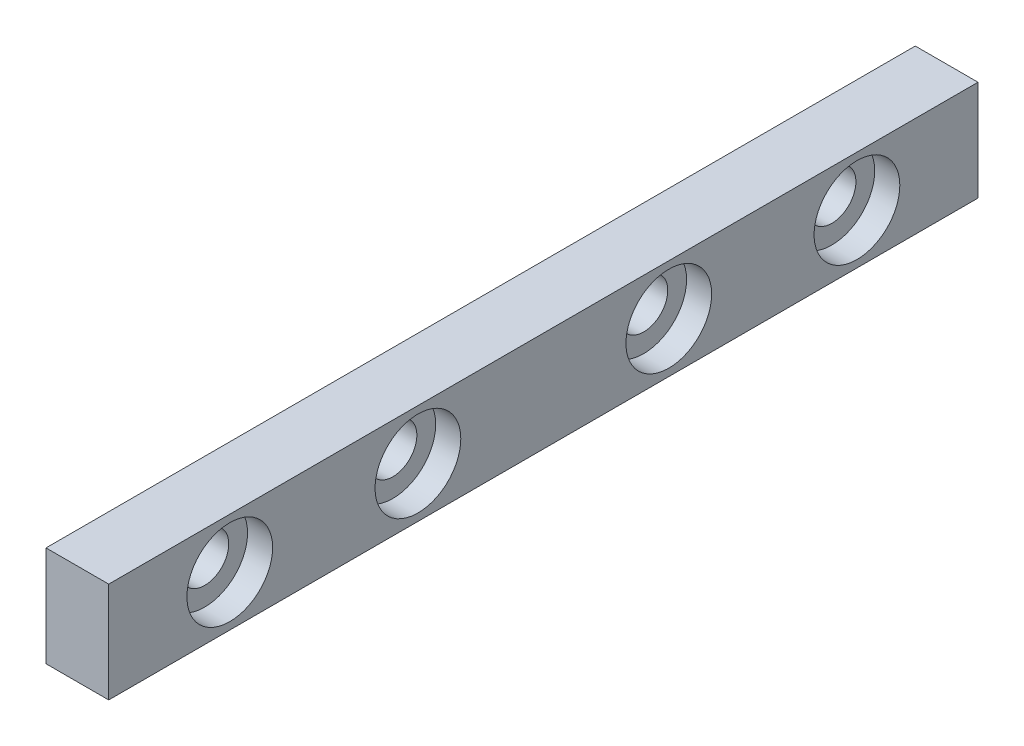
ISO-10303-21;
HEADER;
FILE_DESCRIPTION(('STEP AP214'),'2;1');
FILE_NAME('part.step','',(''),(''),'','','');
FILE_SCHEMA(('AUTOMOTIVE_DESIGN { 1 0 10303 214 1 1 1 1 }'));
ENDSEC;
DATA;
#1=APPLICATION_CONTEXT('core data for automotive mechanical design processes');
#2=APPLICATION_PROTOCOL_DEFINITION('international standard','automotive_design',2000,#1);
#3=PRODUCT_CONTEXT('',#1,'mechanical');
#4=PRODUCT('Part','Part','',(#3));
#5=PRODUCT_RELATED_PRODUCT_CATEGORY('part','',(#4));
#6=PRODUCT_DEFINITION_FORMATION('','',#4);
#7=PRODUCT_DEFINITION_CONTEXT('part definition',#1,'design');
#8=PRODUCT_DEFINITION('design','',#6,#7);
#9=PRODUCT_DEFINITION_SHAPE('','',#8);
#10=(LENGTH_UNIT() NAMED_UNIT(*) SI_UNIT(.MILLI.,.METRE.));
#11=(NAMED_UNIT(*) PLANE_ANGLE_UNIT() SI_UNIT($,.RADIAN.));
#12=(NAMED_UNIT(*) SI_UNIT($,.STERADIAN.) SOLID_ANGLE_UNIT());
#13=UNCERTAINTY_MEASURE_WITH_UNIT(LENGTH_MEASURE(1.E-05),#10,'distance_accuracy_value','');
#14=(GEOMETRIC_REPRESENTATION_CONTEXT(3) GLOBAL_UNCERTAINTY_ASSIGNED_CONTEXT((#13)) GLOBAL_UNIT_ASSIGNED_CONTEXT((#10,
#11,#12)) REPRESENTATION_CONTEXT('',''));
#15=CARTESIAN_POINT('',(0.,0.,0.));
#16=DIRECTION('',(0.,0.,1.));
#17=DIRECTION('',(1.,0.,0.));
#18=AXIS2_PLACEMENT_3D('',#15,#16,#17);
#19=CARTESIAN_POINT('',(3.,2.4,-14.79));
#20=DIRECTION('',(-1.,0.,0.));
#21=DIRECTION('',(0.,0.,1.));
#22=AXIS2_PLACEMENT_3D('',#19,#20,#21);
#23=CYLINDRICAL_SURFACE('',#22,1.15);
#24=CARTESIAN_POINT('',(0.,2.4,-14.79));
#25=DIRECTION('',(1.,0.,0.));
#26=DIRECTION('',(0.,0.,-1.));
#27=AXIS2_PLACEMENT_3D('',#24,#25,#26);
#28=CIRCLE('',#27,1.15);
#29=CARTESIAN_POINT('',(0.,2.4,-15.94));
#30=VERTEX_POINT('',#29);
#31=EDGE_CURVE('E110',#30,#30,#28,.T.);
#32=ORIENTED_EDGE('',*,*,#31,.F.);
#33=EDGE_LOOP('',(#32));
#34=FACE_BOUND('',#33,.T.);
#35=CARTESIAN_POINT('',(1.8,2.4,-14.79));
#36=DIRECTION('',(1.,0.,0.));
#37=DIRECTION('',(0.,0.,-1.));
#38=AXIS2_PLACEMENT_3D('',#35,#36,#37);
#39=CIRCLE('',#38,1.15);
#40=CARTESIAN_POINT('',(1.8,2.4,-15.94));
#41=VERTEX_POINT('',#40);
#42=EDGE_CURVE('E44',#41,#41,#39,.T.);
#43=ORIENTED_EDGE('',*,*,#42,.T.);
#44=EDGE_LOOP('',(#43));
#45=FACE_BOUND('',#44,.T.);
#46=ADVANCED_FACE('F40',(#34,#45),#23,.F.);
#47=CARTESIAN_POINT('',(3.,2.4,-5.79));
#48=DIRECTION('',(-1.,0.,0.));
#49=DIRECTION('',(0.,0.,1.));
#50=AXIS2_PLACEMENT_3D('',#47,#48,#49);
#51=CYLINDRICAL_SURFACE('',#50,1.15);
#52=CARTESIAN_POINT('',(0.,2.4,-5.79));
#53=DIRECTION('',(1.,0.,0.));
#54=DIRECTION('',(0.,0.,-1.));
#55=AXIS2_PLACEMENT_3D('',#52,#53,#54);
#56=CIRCLE('',#55,1.15);
#57=CARTESIAN_POINT('',(0.,2.4,-6.94));
#58=VERTEX_POINT('',#57);
#59=EDGE_CURVE('E136',#58,#58,#56,.T.);
#60=ORIENTED_EDGE('',*,*,#59,.F.);
#61=EDGE_LOOP('',(#60));
#62=FACE_BOUND('',#61,.T.);
#63=CARTESIAN_POINT('',(1.8,2.4,-5.79));
#64=DIRECTION('',(1.,0.,0.));
#65=DIRECTION('',(0.,0.,-1.));
#66=AXIS2_PLACEMENT_3D('',#63,#64,#65);
#67=CIRCLE('',#66,1.15);
#68=CARTESIAN_POINT('',(1.8,2.4,-6.94));
#69=VERTEX_POINT('',#68);
#70=EDGE_CURVE('E122',#69,#69,#67,.T.);
#71=ORIENTED_EDGE('',*,*,#70,.T.);
#72=EDGE_LOOP('',(#71));
#73=FACE_BOUND('',#72,.T.);
#74=ADVANCED_FACE('F151',(#62,#73),#51,.F.);
#75=CARTESIAN_POINT('',(3.,2.4,-26.79));
#76=DIRECTION('',(-1.,0.,0.));
#77=DIRECTION('',(0.,0.,1.));
#78=AXIS2_PLACEMENT_3D('',#75,#76,#77);
#79=CYLINDRICAL_SURFACE('',#78,1.15);
#80=CARTESIAN_POINT('',(0.,2.4,-26.79));
#81=DIRECTION('',(1.,0.,0.));
#82=DIRECTION('',(0.,0.,1.));
#83=AXIS2_PLACEMENT_3D('',#80,#81,#82);
#84=CIRCLE('',#83,1.15);
#85=CARTESIAN_POINT('',(0.,2.4,-25.64));
#86=VERTEX_POINT('',#85);
#87=EDGE_CURVE('E131',#86,#86,#84,.T.);
#88=ORIENTED_EDGE('',*,*,#87,.F.);
#89=EDGE_LOOP('',(#88));
#90=FACE_BOUND('',#89,.T.);
#91=CARTESIAN_POINT('',(1.8,2.4,-26.79));
#92=DIRECTION('',(1.,0.,0.));
#93=DIRECTION('',(0.,0.,-1.));
#94=AXIS2_PLACEMENT_3D('',#91,#92,#93);
#95=CIRCLE('',#94,1.15);
#96=CARTESIAN_POINT('',(1.8,2.4,-27.94));
#97=VERTEX_POINT('',#96);
#98=EDGE_CURVE('E119',#97,#97,#95,.T.);
#99=ORIENTED_EDGE('',*,*,#98,.T.);
#100=EDGE_LOOP('',(#99));
#101=FACE_BOUND('',#100,.T.);
#102=ADVANCED_FACE('F156',(#90,#101),#79,.F.);
#103=CARTESIAN_POINT('',(3.,2.4,-35.79));
#104=DIRECTION('',(-1.,0.,0.));
#105=DIRECTION('',(0.,0.,1.));
#106=AXIS2_PLACEMENT_3D('',#103,#104,#105);
#107=CYLINDRICAL_SURFACE('',#106,1.15);
#108=CARTESIAN_POINT('',(0.,2.4,-35.79));
#109=DIRECTION('',(1.,0.,0.));
#110=DIRECTION('',(0.,0.,1.));
#111=AXIS2_PLACEMENT_3D('',#108,#109,#110);
#112=CIRCLE('',#111,1.15);
#113=CARTESIAN_POINT('',(0.,2.4,-34.64));
#114=VERTEX_POINT('',#113);
#115=EDGE_CURVE('E127',#114,#114,#112,.T.);
#116=ORIENTED_EDGE('',*,*,#115,.F.);
#117=EDGE_LOOP('',(#116));
#118=FACE_BOUND('',#117,.T.);
#119=CARTESIAN_POINT('',(1.8,2.4,-35.79));
#120=DIRECTION('',(1.,0.,0.));
#121=DIRECTION('',(0.,0.,-1.));
#122=AXIS2_PLACEMENT_3D('',#119,#120,#121);
#123=CIRCLE('',#122,1.15);
#124=CARTESIAN_POINT('',(1.8,2.4,-36.94));
#125=VERTEX_POINT('',#124);
#126=EDGE_CURVE('E116',#125,#125,#123,.T.);
#127=ORIENTED_EDGE('',*,*,#126,.T.);
#128=EDGE_LOOP('',(#127));
#129=FACE_BOUND('',#128,.T.);
#130=ADVANCED_FACE('F163',(#118,#129),#107,.F.);
#131=CARTESIAN_POINT('',(3.,0.,0.));
#132=DIRECTION('',(-1.,0.,0.));
#133=DIRECTION('',(0.,0.,1.));
#134=AXIS2_PLACEMENT_3D('',#131,#132,#133);
#135=PLANE('',#134);
#136=CARTESIAN_POINT('',(3.,2.4,-5.79));
#137=DIRECTION('',(1.,0.,0.));
#138=DIRECTION('',(0.,0.,-1.));
#139=AXIS2_PLACEMENT_3D('',#136,#137,#138);
#140=CIRCLE('',#139,2.05);
#141=CARTESIAN_POINT('',(3.,2.4,-7.84));
#142=VERTEX_POINT('',#141);
#143=EDGE_CURVE('E365',#142,#142,#140,.T.);
#144=ORIENTED_EDGE('',*,*,#143,.F.);
#145=EDGE_LOOP('',(#144));
#146=FACE_BOUND('',#145,.T.);
#147=CARTESIAN_POINT('',(3.,2.4,-14.79));
#148=DIRECTION('',(1.,0.,0.));
#149=DIRECTION('',(0.,0.,-1.));
#150=AXIS2_PLACEMENT_3D('',#147,#148,#149);
#151=CIRCLE('',#150,2.05);
#152=CARTESIAN_POINT('',(3.,2.4,-16.84));
#153=VERTEX_POINT('',#152);
#154=EDGE_CURVE('E361',#153,#153,#151,.T.);
#155=ORIENTED_EDGE('',*,*,#154,.F.);
#156=EDGE_LOOP('',(#155));
#157=FACE_BOUND('',#156,.T.);
#158=CARTESIAN_POINT('',(3.,2.4,-26.79));
#159=DIRECTION('',(1.,0.,0.));
#160=DIRECTION('',(0.,0.,-1.));
#161=AXIS2_PLACEMENT_3D('',#158,#159,#160);
#162=CIRCLE('',#161,2.05);
#163=CARTESIAN_POINT('',(3.,2.4,-28.84));
#164=VERTEX_POINT('',#163);
#165=EDGE_CURVE('E362',#164,#164,#162,.T.);
#166=ORIENTED_EDGE('',*,*,#165,.F.);
#167=EDGE_LOOP('',(#166));
#168=FACE_BOUND('',#167,.T.);
#169=CARTESIAN_POINT('',(3.,2.4,-35.79));
#170=DIRECTION('',(1.,0.,0.));
#171=DIRECTION('',(0.,0.,-1.));
#172=AXIS2_PLACEMENT_3D('',#169,#170,#171);
#173=CIRCLE('',#172,2.04999999999999);
#174=CARTESIAN_POINT('',(3.,2.4,-37.84));
#175=VERTEX_POINT('',#174);
#176=EDGE_CURVE('E373',#175,#175,#173,.T.);
#177=ORIENTED_EDGE('',*,*,#176,.F.);
#178=EDGE_LOOP('',(#177));
#179=FACE_BOUND('',#178,.T.);
#180=DIRECTION('',(0.,-1.,0.));
#181=VECTOR('',#180,1.);
#182=CARTESIAN_POINT('',(3.,0.,0.));
#183=LINE('',#182,#181);
#184=CARTESIAN_POINT('',(3.,4.8,0.));
#185=VERTEX_POINT('',#184);
#186=CARTESIAN_POINT('',(3.,0.,0.));
#187=VERTEX_POINT('',#186);
#188=EDGE_CURVE('E94',#185,#187,#183,.T.);
#189=ORIENTED_EDGE('',*,*,#188,.T.);
#190=DIRECTION('',(0.,0.,-1.));
#191=VECTOR('',#190,1.);
#192=CARTESIAN_POINT('',(3.,0.,0.));
#193=LINE('',#192,#191);
#194=CARTESIAN_POINT('',(3.,0.,-41.58));
#195=VERTEX_POINT('',#194);
#196=EDGE_CURVE('E89',#187,#195,#193,.T.);
#197=ORIENTED_EDGE('',*,*,#196,.T.);
#198=DIRECTION('',(0.,1.,0.));
#199=VECTOR('',#198,1.);
#200=CARTESIAN_POINT('',(3.,0.,-41.58));
#201=LINE('',#200,#199);
#202=CARTESIAN_POINT('',(3.,4.8,-41.58));
#203=VERTEX_POINT('',#202);
#204=EDGE_CURVE('E92',#195,#203,#201,.T.);
#205=ORIENTED_EDGE('',*,*,#204,.T.);
#206=DIRECTION('',(0.,0.,1.));
#207=VECTOR('',#206,1.);
#208=CARTESIAN_POINT('',(3.,4.8,0.));
#209=LINE('',#208,#207);
#210=EDGE_CURVE('E59',#203,#185,#209,.T.);
#211=ORIENTED_EDGE('',*,*,#210,.T.);
#212=EDGE_LOOP('',(#189,#197,#205,#211));
#213=FACE_BOUND('',#212,.T.);
#214=ADVANCED_FACE('F90',(#146,#157,#168,#179,#213),#135,.F.);
#215=CARTESIAN_POINT('',(0.,0.,0.));
#216=DIRECTION('',(-1.,0.,0.));
#217=DIRECTION('',(0.,0.,1.));
#218=AXIS2_PLACEMENT_3D('',#215,#216,#217);
#219=PLANE('',#218);
#220=ORIENTED_EDGE('',*,*,#87,.T.);
#221=EDGE_LOOP('',(#220));
#222=FACE_BOUND('',#221,.T.);
#223=ORIENTED_EDGE('',*,*,#31,.T.);
#224=EDGE_LOOP('',(#223));
#225=FACE_BOUND('',#224,.T.);
#226=DIRECTION('',(0.,-1.,0.));
#227=VECTOR('',#226,1.);
#228=CARTESIAN_POINT('',(0.,0.,0.));
#229=LINE('',#228,#227);
#230=CARTESIAN_POINT('',(0.,4.8,0.));
#231=VERTEX_POINT('',#230);
#232=CARTESIAN_POINT('',(0.,0.,0.));
#233=VERTEX_POINT('',#232);
#234=EDGE_CURVE('E107',#231,#233,#229,.T.);
#235=ORIENTED_EDGE('',*,*,#234,.F.);
#236=DIRECTION('',(0.,0.,1.));
#237=VECTOR('',#236,1.);
#238=CARTESIAN_POINT('',(0.,4.8,0.));
#239=LINE('',#238,#237);
#240=CARTESIAN_POINT('',(0.,4.8,-41.58));
#241=VERTEX_POINT('',#240);
#242=EDGE_CURVE('E82',#241,#231,#239,.T.);
#243=ORIENTED_EDGE('',*,*,#242,.F.);
#244=DIRECTION('',(0.,1.,0.));
#245=VECTOR('',#244,1.);
#246=CARTESIAN_POINT('',(0.,0.,-41.58));
#247=LINE('',#246,#245);
#248=CARTESIAN_POINT('',(0.,0.,-41.58));
#249=VERTEX_POINT('',#248);
#250=EDGE_CURVE('E76',#249,#241,#247,.T.);
#251=ORIENTED_EDGE('',*,*,#250,.F.);
#252=DIRECTION('',(0.,0.,-1.));
#253=VECTOR('',#252,1.);
#254=CARTESIAN_POINT('',(0.,0.,0.));
#255=LINE('',#254,#253);
#256=EDGE_CURVE('E98',#233,#249,#255,.T.);
#257=ORIENTED_EDGE('',*,*,#256,.F.);
#258=EDGE_LOOP('',(#235,#243,#251,#257));
#259=FACE_BOUND('',#258,.T.);
#260=ORIENTED_EDGE('',*,*,#59,.T.);
#261=EDGE_LOOP('',(#260));
#262=FACE_BOUND('',#261,.T.);
#263=ORIENTED_EDGE('',*,*,#115,.T.);
#264=EDGE_LOOP('',(#263));
#265=FACE_BOUND('',#264,.T.);
#266=ADVANCED_FACE('F147',(#222,#225,#259,#262,#265),#219,.T.);
#267=CARTESIAN_POINT('',(3.,0.,0.));
#268=DIRECTION('',(0.,0.,-1.));
#269=DIRECTION('',(-1.,0.,0.));
#270=AXIS2_PLACEMENT_3D('',#267,#268,#269);
#271=PLANE('',#270);
#272=ORIENTED_EDGE('',*,*,#234,.T.);
#273=DIRECTION('',(-1.,0.,0.));
#274=VECTOR('',#273,1.);
#275=CARTESIAN_POINT('',(3.,0.,0.));
#276=LINE('',#275,#274);
#277=EDGE_CURVE('E11',#187,#233,#276,.T.);
#278=ORIENTED_EDGE('',*,*,#277,.F.);
#279=ORIENTED_EDGE('',*,*,#188,.F.);
#280=DIRECTION('',(-1.,0.,0.));
#281=VECTOR('',#280,1.);
#282=CARTESIAN_POINT('',(3.,4.8,0.));
#283=LINE('',#282,#281);
#284=EDGE_CURVE('E103',#185,#231,#283,.T.);
#285=ORIENTED_EDGE('',*,*,#284,.T.);
#286=EDGE_LOOP('',(#272,#278,#279,#285));
#287=FACE_BOUND('',#286,.T.);
#288=ADVANCED_FACE('F42',(#287),#271,.F.);
#289=CARTESIAN_POINT('',(3.,0.,0.));
#290=DIRECTION('',(0.,1.,0.));
#291=DIRECTION('',(0.,0.,1.));
#292=AXIS2_PLACEMENT_3D('',#289,#290,#291);
#293=PLANE('',#292);
#294=ORIENTED_EDGE('',*,*,#256,.T.);
#295=DIRECTION('',(-1.,0.,0.));
#296=VECTOR('',#295,1.);
#297=CARTESIAN_POINT('',(3.,0.,-41.58));
#298=LINE('',#297,#296);
#299=EDGE_CURVE('E50',#195,#249,#298,.T.);
#300=ORIENTED_EDGE('',*,*,#299,.F.);
#301=ORIENTED_EDGE('',*,*,#196,.F.);
#302=ORIENTED_EDGE('',*,*,#277,.T.);
#303=EDGE_LOOP('',(#294,#300,#301,#302));
#304=FACE_BOUND('',#303,.T.);
#305=ADVANCED_FACE('F97',(#304),#293,.F.);
#306=CARTESIAN_POINT('',(3.,0.,-41.58));
#307=DIRECTION('',(0.,0.,1.));
#308=DIRECTION('',(1.,0.,0.));
#309=AXIS2_PLACEMENT_3D('',#306,#307,#308);
#310=PLANE('',#309);
#311=ORIENTED_EDGE('',*,*,#250,.T.);
#312=DIRECTION('',(-1.,0.,0.));
#313=VECTOR('',#312,1.);
#314=CARTESIAN_POINT('',(3.,4.8,-41.58));
#315=LINE('',#314,#313);
#316=EDGE_CURVE('E99',#203,#241,#315,.T.);
#317=ORIENTED_EDGE('',*,*,#316,.F.);
#318=ORIENTED_EDGE('',*,*,#204,.F.);
#319=ORIENTED_EDGE('',*,*,#299,.T.);
#320=EDGE_LOOP('',(#311,#317,#318,#319));
#321=FACE_BOUND('',#320,.T.);
#322=ADVANCED_FACE('F101',(#321),#310,.F.);
#323=CARTESIAN_POINT('',(3.,4.8,0.));
#324=DIRECTION('',(0.,-1.,0.));
#325=DIRECTION('',(0.,0.,-1.));
#326=AXIS2_PLACEMENT_3D('',#323,#324,#325);
#327=PLANE('',#326);
#328=ORIENTED_EDGE('',*,*,#242,.T.);
#329=ORIENTED_EDGE('',*,*,#284,.F.);
#330=ORIENTED_EDGE('',*,*,#210,.F.);
#331=ORIENTED_EDGE('',*,*,#316,.T.);
#332=EDGE_LOOP('',(#328,#329,#330,#331));
#333=FACE_BOUND('',#332,.T.);
#334=ADVANCED_FACE('F168',(#333),#327,.F.);
#335=CARTESIAN_POINT('',(1.8,2.4,-35.79));
#336=DIRECTION('',(1.,0.,0.));
#337=DIRECTION('',(0.,0.,-1.));
#338=AXIS2_PLACEMENT_3D('',#335,#336,#337);
#339=CYLINDRICAL_SURFACE('',#338,2.04999999999999);
#340=CARTESIAN_POINT('',(1.8,2.4,-35.79));
#341=DIRECTION('',(1.,0.,0.));
#342=DIRECTION('',(0.,0.,-1.));
#343=AXIS2_PLACEMENT_3D('',#340,#341,#342);
#344=CIRCLE('',#343,2.04999999999999);
#345=CARTESIAN_POINT('',(1.8,2.4,-37.84));
#346=VERTEX_POINT('',#345);
#347=EDGE_CURVE('E139',#346,#346,#344,.T.);
#348=ORIENTED_EDGE('',*,*,#347,.F.);
#349=EDGE_LOOP('',(#348));
#350=FACE_BOUND('',#349,.T.);
#351=ORIENTED_EDGE('',*,*,#176,.T.);
#352=EDGE_LOOP('',(#351));
#353=FACE_BOUND('',#352,.T.);
#354=ADVANCED_FACE('F171',(#350,#353),#339,.F.);
#355=CARTESIAN_POINT('',(1.8,2.4,-35.79));
#356=DIRECTION('',(1.,0.,0.));
#357=DIRECTION('',(0.,0.,-1.));
#358=AXIS2_PLACEMENT_3D('',#355,#356,#357);
#359=PLANE('',#358);
#360=ORIENTED_EDGE('',*,*,#126,.F.);
#361=EDGE_LOOP('',(#360));
#362=FACE_BOUND('',#361,.T.);
#363=ORIENTED_EDGE('',*,*,#347,.T.);
#364=EDGE_LOOP('',(#363));
#365=FACE_BOUND('',#364,.T.);
#366=ADVANCED_FACE('F269',(#362,#365),#359,.T.);
#367=CARTESIAN_POINT('',(1.8,2.4,-26.79));
#368=DIRECTION('',(1.,0.,0.));
#369=DIRECTION('',(0.,0.,-1.));
#370=AXIS2_PLACEMENT_3D('',#367,#368,#369);
#371=CYLINDRICAL_SURFACE('',#370,2.05);
#372=CARTESIAN_POINT('',(1.8,2.4,-26.79));
#373=DIRECTION('',(1.,0.,0.));
#374=DIRECTION('',(0.,0.,-1.));
#375=AXIS2_PLACEMENT_3D('',#372,#373,#374);
#376=CIRCLE('',#375,2.05);
#377=CARTESIAN_POINT('',(1.8,2.4,-28.84));
#378=VERTEX_POINT('',#377);
#379=EDGE_CURVE('E368',#378,#378,#376,.T.);
#380=ORIENTED_EDGE('',*,*,#379,.F.);
#381=EDGE_LOOP('',(#380));
#382=FACE_BOUND('',#381,.T.);
#383=ORIENTED_EDGE('',*,*,#165,.T.);
#384=EDGE_LOOP('',(#383));
#385=FACE_BOUND('',#384,.T.);
#386=ADVANCED_FACE('F280',(#382,#385),#371,.F.);
#387=CARTESIAN_POINT('',(1.8,2.4,-26.79));
#388=DIRECTION('',(1.,0.,0.));
#389=DIRECTION('',(0.,0.,-1.));
#390=AXIS2_PLACEMENT_3D('',#387,#388,#389);
#391=PLANE('',#390);
#392=ORIENTED_EDGE('',*,*,#98,.F.);
#393=EDGE_LOOP('',(#392));
#394=FACE_BOUND('',#393,.T.);
#395=ORIENTED_EDGE('',*,*,#379,.T.);
#396=EDGE_LOOP('',(#395));
#397=FACE_BOUND('',#396,.T.);
#398=ADVANCED_FACE('F291',(#394,#397),#391,.T.);
#399=CARTESIAN_POINT('',(1.8,2.4,-5.79));
#400=DIRECTION('',(1.,0.,0.));
#401=DIRECTION('',(0.,0.,-1.));
#402=AXIS2_PLACEMENT_3D('',#399,#400,#401);
#403=CYLINDRICAL_SURFACE('',#402,2.05);
#404=CARTESIAN_POINT('',(1.8,2.4,-5.79));
#405=DIRECTION('',(1.,0.,0.));
#406=DIRECTION('',(0.,0.,-1.));
#407=AXIS2_PLACEMENT_3D('',#404,#405,#406);
#408=CIRCLE('',#407,2.05);
#409=CARTESIAN_POINT('',(1.8,2.4,-7.84));
#410=VERTEX_POINT('',#409);
#411=EDGE_CURVE('E120',#410,#410,#408,.T.);
#412=ORIENTED_EDGE('',*,*,#411,.F.);
#413=EDGE_LOOP('',(#412));
#414=FACE_BOUND('',#413,.T.);
#415=ORIENTED_EDGE('',*,*,#143,.T.);
#416=EDGE_LOOP('',(#415));
#417=FACE_BOUND('',#416,.T.);
#418=ADVANCED_FACE('F302',(#414,#417),#403,.F.);
#419=CARTESIAN_POINT('',(1.8,2.4,-5.79));
#420=DIRECTION('',(1.,0.,0.));
#421=DIRECTION('',(0.,0.,-1.));
#422=AXIS2_PLACEMENT_3D('',#419,#420,#421);
#423=PLANE('',#422);
#424=ORIENTED_EDGE('',*,*,#70,.F.);
#425=EDGE_LOOP('',(#424));
#426=FACE_BOUND('',#425,.T.);
#427=ORIENTED_EDGE('',*,*,#411,.T.);
#428=EDGE_LOOP('',(#427));
#429=FACE_BOUND('',#428,.T.);
#430=ADVANCED_FACE('F313',(#426,#429),#423,.T.);
#431=CARTESIAN_POINT('',(1.8,2.4,-14.79));
#432=DIRECTION('',(1.,0.,0.));
#433=DIRECTION('',(0.,0.,-1.));
#434=AXIS2_PLACEMENT_3D('',#431,#432,#433);
#435=CYLINDRICAL_SURFACE('',#434,2.05);
#436=CARTESIAN_POINT('',(1.8,2.4,-14.79));
#437=DIRECTION('',(1.,0.,0.));
#438=DIRECTION('',(0.,0.,-1.));
#439=AXIS2_PLACEMENT_3D('',#436,#437,#438);
#440=CIRCLE('',#439,2.05);
#441=CARTESIAN_POINT('',(1.8,2.4,-16.84));
#442=VERTEX_POINT('',#441);
#443=EDGE_CURVE('E360',#442,#442,#440,.T.);
#444=ORIENTED_EDGE('',*,*,#443,.F.);
#445=EDGE_LOOP('',(#444));
#446=FACE_BOUND('',#445,.T.);
#447=ORIENTED_EDGE('',*,*,#154,.T.);
#448=EDGE_LOOP('',(#447));
#449=FACE_BOUND('',#448,.T.);
#450=ADVANCED_FACE('F324',(#446,#449),#435,.F.);
#451=CARTESIAN_POINT('',(1.8,2.4,-14.79));
#452=DIRECTION('',(1.,0.,0.));
#453=DIRECTION('',(0.,0.,-1.));
#454=AXIS2_PLACEMENT_3D('',#451,#452,#453);
#455=PLANE('',#454);
#456=ORIENTED_EDGE('',*,*,#42,.F.);
#457=EDGE_LOOP('',(#456));
#458=FACE_BOUND('',#457,.T.);
#459=ORIENTED_EDGE('',*,*,#443,.T.);
#460=EDGE_LOOP('',(#459));
#461=FACE_BOUND('',#460,.T.);
#462=ADVANCED_FACE('F335',(#458,#461),#455,.T.);
#463=CLOSED_SHELL('',(#46,#74,#102,#130,#214,#266,#288,#305,#322,#334,#354,#366,#386,#398,#418,
#430,#450,#462));
#464=MANIFOLD_SOLID_BREP('B2',#463);
#465=ADVANCED_BREP_SHAPE_REPRESENTATION('',(#18,#464),#14);
#466=SHAPE_DEFINITION_REPRESENTATION(#9,#465);
ENDSEC;
END-ISO-10303-21;
